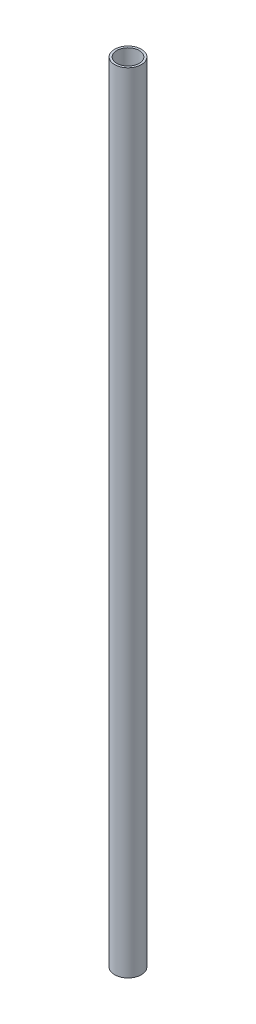
ISO-10303-21;
HEADER;
FILE_DESCRIPTION(('STEP AP214'),'2;1');
FILE_NAME('part.step','',(''),(''),'','','');
FILE_SCHEMA(('AUTOMOTIVE_DESIGN { 1 0 10303 214 1 1 1 1 }'));
ENDSEC;
DATA;
#1=APPLICATION_CONTEXT('core data for automotive mechanical design processes');
#2=APPLICATION_PROTOCOL_DEFINITION('international standard','automotive_design',2000,#1);
#3=PRODUCT_CONTEXT('',#1,'mechanical');
#4=PRODUCT('Part','Part','',(#3));
#5=PRODUCT_RELATED_PRODUCT_CATEGORY('part','',(#4));
#6=PRODUCT_DEFINITION_FORMATION('','',#4);
#7=PRODUCT_DEFINITION_CONTEXT('part definition',#1,'design');
#8=PRODUCT_DEFINITION('design','',#6,#7);
#9=PRODUCT_DEFINITION_SHAPE('','',#8);
#10=(LENGTH_UNIT() NAMED_UNIT(*) SI_UNIT(.MILLI.,.METRE.));
#11=(NAMED_UNIT(*) PLANE_ANGLE_UNIT() SI_UNIT($,.RADIAN.));
#12=(NAMED_UNIT(*) SI_UNIT($,.STERADIAN.) SOLID_ANGLE_UNIT());
#13=UNCERTAINTY_MEASURE_WITH_UNIT(LENGTH_MEASURE(1.E-05),#10,'distance_accuracy_value','');
#14=(GEOMETRIC_REPRESENTATION_CONTEXT(3) GLOBAL_UNCERTAINTY_ASSIGNED_CONTEXT((#13)) GLOBAL_UNIT_ASSIGNED_CONTEXT((#10,
#11,#12)) REPRESENTATION_CONTEXT('',''));
#15=CARTESIAN_POINT('',(0.,0.,0.));
#16=DIRECTION('',(0.,0.,1.));
#17=DIRECTION('',(1.,0.,0.));
#18=AXIS2_PLACEMENT_3D('',#15,#16,#17);
#19=CARTESIAN_POINT('',(0.,738.,0.));
#20=DIRECTION('',(0.,1.,0.));
#21=DIRECTION('',(0.,0.,1.));
#22=AXIS2_PLACEMENT_3D('',#19,#20,#21);
#23=PLANE('',#22);
#24=CARTESIAN_POINT('',(0.,738.,0.));
#25=DIRECTION('',(0.,1.,0.));
#26=DIRECTION('',(0.,0.,1.));
#27=AXIS2_PLACEMENT_3D('',#24,#25,#26);
#28=CIRCLE('',#27,12.500000019);
#29=CARTESIAN_POINT('',(0.,738.,12.500000019));
#30=VERTEX_POINT('',#29);
#31=EDGE_CURVE('E10',#30,#30,#28,.T.);
#32=ORIENTED_EDGE('',*,*,#31,.T.);
#33=EDGE_LOOP('',(#32));
#34=FACE_BOUND('',#33,.T.);
#35=CARTESIAN_POINT('',(0.,738.,0.));
#36=DIRECTION('',(0.,1.,0.));
#37=DIRECTION('',(0.,0.,1.));
#38=AXIS2_PLACEMENT_3D('',#35,#36,#37);
#39=CIRCLE('',#38,10.499999955);
#40=CARTESIAN_POINT('',(0.,738.,10.499999955));
#41=VERTEX_POINT('',#40);
#42=EDGE_CURVE('E48',#41,#41,#39,.T.);
#43=ORIENTED_EDGE('',*,*,#42,.F.);
#44=EDGE_LOOP('',(#43));
#45=FACE_BOUND('',#44,.T.);
#46=ADVANCED_FACE('F37',(#34,#45),#23,.T.);
#47=CARTESIAN_POINT('',(0.,0.,0.));
#48=DIRECTION('',(0.,1.,0.));
#49=DIRECTION('',(0.,0.,1.));
#50=AXIS2_PLACEMENT_3D('',#47,#48,#49);
#51=PLANE('',#50);
#52=CARTESIAN_POINT('',(0.,0.,0.));
#53=DIRECTION('',(0.,1.,0.));
#54=DIRECTION('',(0.,0.,1.));
#55=AXIS2_PLACEMENT_3D('',#52,#53,#54);
#56=CIRCLE('',#55,12.500000019);
#57=CARTESIAN_POINT('',(0.,0.,12.500000019));
#58=VERTEX_POINT('',#57);
#59=EDGE_CURVE('E41',#58,#58,#56,.T.);
#60=ORIENTED_EDGE('',*,*,#59,.F.);
#61=EDGE_LOOP('',(#60));
#62=FACE_BOUND('',#61,.T.);
#63=CARTESIAN_POINT('',(0.,0.,0.));
#64=DIRECTION('',(0.,1.,0.));
#65=DIRECTION('',(0.,0.,1.));
#66=AXIS2_PLACEMENT_3D('',#63,#64,#65);
#67=CIRCLE('',#66,10.499999955);
#68=CARTESIAN_POINT('',(0.,0.,10.499999955));
#69=VERTEX_POINT('',#68);
#70=EDGE_CURVE('E50',#69,#69,#67,.T.);
#71=ORIENTED_EDGE('',*,*,#70,.T.);
#72=EDGE_LOOP('',(#71));
#73=FACE_BOUND('',#72,.T.);
#74=ADVANCED_FACE('F60',(#62,#73),#51,.F.);
#75=CARTESIAN_POINT('',(0.,738.,0.));
#76=DIRECTION('',(0.,-1.,0.));
#77=DIRECTION('',(0.,0.,-1.));
#78=AXIS2_PLACEMENT_3D('',#75,#76,#77);
#79=CYLINDRICAL_SURFACE('',#78,12.500000019);
#80=ORIENTED_EDGE('',*,*,#31,.F.);
#81=EDGE_LOOP('',(#80));
#82=FACE_BOUND('',#81,.T.);
#83=ORIENTED_EDGE('',*,*,#59,.T.);
#84=EDGE_LOOP('',(#83));
#85=FACE_BOUND('',#84,.T.);
#86=ADVANCED_FACE('F39',(#82,#85),#79,.T.);
#87=CARTESIAN_POINT('',(0.,738.,0.));
#88=DIRECTION('',(0.,-1.,0.));
#89=DIRECTION('',(0.,0.,-1.));
#90=AXIS2_PLACEMENT_3D('',#87,#88,#89);
#91=CYLINDRICAL_SURFACE('',#90,10.499999955);
#92=ORIENTED_EDGE('',*,*,#42,.T.);
#93=EDGE_LOOP('',(#92));
#94=FACE_BOUND('',#93,.T.);
#95=ORIENTED_EDGE('',*,*,#70,.F.);
#96=EDGE_LOOP('',(#95));
#97=FACE_BOUND('',#96,.T.);
#98=ADVANCED_FACE('F56',(#94,#97),#91,.F.);
#99=CLOSED_SHELL('',(#46,#74,#86,#98));
#100=MANIFOLD_SOLID_BREP('B2',#99);
#101=ADVANCED_BREP_SHAPE_REPRESENTATION('',(#18,#100),#14);
#102=SHAPE_DEFINITION_REPRESENTATION(#9,#101);
ENDSEC;
END-ISO-10303-21;
